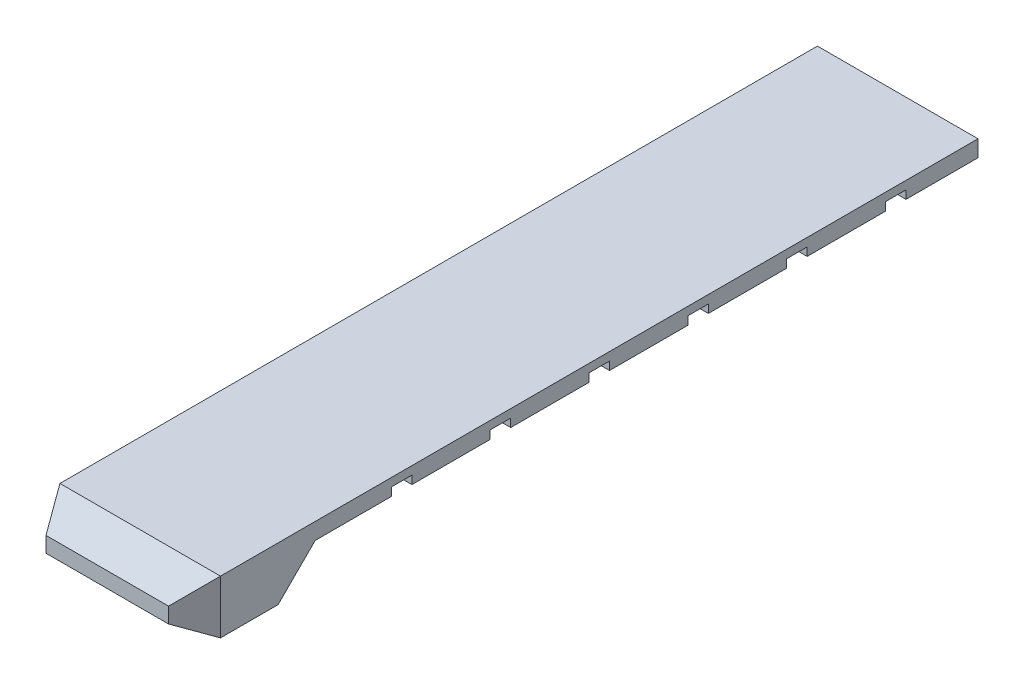
ISO-10303-21;
HEADER;
FILE_DESCRIPTION(('STEP AP214'),'2;1');
FILE_NAME('part.step','',(''),(''),'','','');
FILE_SCHEMA(('AUTOMOTIVE_DESIGN { 1 0 10303 214 1 1 1 1 }'));
ENDSEC;
DATA;
#1=APPLICATION_CONTEXT('core data for automotive mechanical design processes');
#2=APPLICATION_PROTOCOL_DEFINITION('international standard','automotive_design',2000,#1);
#3=PRODUCT_CONTEXT('',#1,'mechanical');
#4=PRODUCT('Part','Part','',(#3));
#5=PRODUCT_RELATED_PRODUCT_CATEGORY('part','',(#4));
#6=PRODUCT_DEFINITION_FORMATION('','',#4);
#7=PRODUCT_DEFINITION_CONTEXT('part definition',#1,'design');
#8=PRODUCT_DEFINITION('design','',#6,#7);
#9=PRODUCT_DEFINITION_SHAPE('','',#8);
#10=(LENGTH_UNIT() NAMED_UNIT(*) SI_UNIT(.MILLI.,.METRE.));
#11=(NAMED_UNIT(*) PLANE_ANGLE_UNIT() SI_UNIT($,.RADIAN.));
#12=(NAMED_UNIT(*) SI_UNIT($,.STERADIAN.) SOLID_ANGLE_UNIT());
#13=UNCERTAINTY_MEASURE_WITH_UNIT(LENGTH_MEASURE(1.E-05),#10,'distance_accuracy_value','');
#14=(GEOMETRIC_REPRESENTATION_CONTEXT(3) GLOBAL_UNCERTAINTY_ASSIGNED_CONTEXT((#13)) GLOBAL_UNIT_ASSIGNED_CONTEXT((#10,
#11,#12)) REPRESENTATION_CONTEXT('',''));
#15=CARTESIAN_POINT('',(0.,0.,0.));
#16=DIRECTION('',(0.,0.,1.));
#17=DIRECTION('',(1.,0.,0.));
#18=AXIS2_PLACEMENT_3D('',#15,#16,#17);
#19=CARTESIAN_POINT('',(212.999999374151,0.,-54.3));
#20=DIRECTION('',(1.,0.,0.));
#21=DIRECTION('',(0.,0.,1.));
#22=AXIS2_PLACEMENT_3D('',#19,#20,#21);
#23=PLANE('',#22);
#24=DIRECTION('',(0.,-1.,0.));
#25=VECTOR('',#24,1.);
#26=CARTESIAN_POINT('',(212.999999374151,0.75000000000003,-67.2000003576276));
#27=LINE('',#26,#25);
#28=CARTESIAN_POINT('',(212.999999374151,2.7,-67.2000003576276));
#29=VERTEX_POINT('',#28);
#30=CARTESIAN_POINT('',(212.999999374151,1.5,-67.2000003576276));
#31=VERTEX_POINT('',#30);
#32=EDGE_CURVE('E367',#29,#31,#27,.T.);
#33=ORIENTED_EDGE('',*,*,#32,.T.);
#34=DIRECTION('',(0.,0.,-1.));
#35=VECTOR('',#34,1.);
#36=CARTESIAN_POINT('',(212.999999374151,1.5,-12.9));
#37=LINE('',#36,#35);
#38=CARTESIAN_POINT('',(212.999999374151,1.5,-55.8000003576279));
#39=VERTEX_POINT('',#38);
#40=EDGE_CURVE('E331',#39,#31,#37,.T.);
#41=ORIENTED_EDGE('',*,*,#40,.F.);
#42=DIRECTION('',(0.,1.,0.));
#43=VECTOR('',#42,1.);
#44=CARTESIAN_POINT('',(212.999999374151,0.750000000000024,-55.8000003576279));
#45=LINE('',#44,#43);
#46=CARTESIAN_POINT('',(212.999999374151,2.7,-55.8000003576279));
#47=VERTEX_POINT('',#46);
#48=EDGE_CURVE('E470',#39,#47,#45,.T.);
#49=ORIENTED_EDGE('',*,*,#48,.T.);
#50=DIRECTION('',(0.,0.,1.));
#51=VECTOR('',#50,1.);
#52=CARTESIAN_POINT('',(212.999999374151,2.7,-54.3000001788139));
#53=LINE('',#52,#51);
#54=CARTESIAN_POINT('',(212.999999374151,2.7,-52.8000003576279));
#55=VERTEX_POINT('',#54);
#56=EDGE_CURVE('E538',#47,#55,#53,.T.);
#57=ORIENTED_EDGE('',*,*,#56,.T.);
#58=DIRECTION('',(0.,-1.,0.));
#59=VECTOR('',#58,1.);
#60=CARTESIAN_POINT('',(212.999999374151,0.750000000000024,-52.8000003576279));
#61=LINE('',#60,#59);
#62=CARTESIAN_POINT('',(212.999999374151,1.5,-52.8000003576279));
#63=VERTEX_POINT('',#62);
#64=EDGE_CURVE('E466',#55,#63,#61,.T.);
#65=ORIENTED_EDGE('',*,*,#64,.T.);
#66=DIRECTION('',(0.,0.,-1.));
#67=VECTOR('',#66,1.);
#68=CARTESIAN_POINT('',(212.999999374151,1.5,-12.9));
#69=LINE('',#68,#67);
#70=CARTESIAN_POINT('',(212.999999374151,1.5,-41.4000003576279));
#71=VERTEX_POINT('',#70);
#72=EDGE_CURVE('E478',#71,#63,#69,.T.);
#73=ORIENTED_EDGE('',*,*,#72,.F.);
#74=DIRECTION('',(0.,1.,0.));
#75=VECTOR('',#74,1.);
#76=CARTESIAN_POINT('',(212.999999374151,0.750000000000024,-41.4000003576279));
#77=LINE('',#76,#75);
#78=CARTESIAN_POINT('',(212.999999374151,2.7,-41.4000003576279));
#79=VERTEX_POINT('',#78);
#80=EDGE_CURVE('E557',#71,#79,#77,.T.);
#81=ORIENTED_EDGE('',*,*,#80,.T.);
#82=DIRECTION('',(0.,0.,1.));
#83=VECTOR('',#82,1.);
#84=CARTESIAN_POINT('',(212.999999374151,2.7,-47.1000001788139));
#85=LINE('',#84,#83);
#86=CARTESIAN_POINT('',(212.999999374151,2.7,-38.4000003576279));
#87=VERTEX_POINT('',#86);
#88=EDGE_CURVE('E571',#79,#87,#85,.T.);
#89=ORIENTED_EDGE('',*,*,#88,.T.);
#90=DIRECTION('',(0.,-1.,0.));
#91=VECTOR('',#90,1.);
#92=CARTESIAN_POINT('',(212.999999374151,0.750000000000024,-38.4000003576279));
#93=LINE('',#92,#91);
#94=CARTESIAN_POINT('',(212.999999374151,1.5,-38.4000003576279));
#95=VERTEX_POINT('',#94);
#96=EDGE_CURVE('E339',#87,#95,#93,.T.);
#97=ORIENTED_EDGE('',*,*,#96,.T.);
#98=DIRECTION('',(0.,0.,-1.));
#99=VECTOR('',#98,1.);
#100=CARTESIAN_POINT('',(212.999999374151,1.5,-12.9));
#101=LINE('',#100,#99);
#102=CARTESIAN_POINT('',(212.999999374151,1.5,-27.0000003576279));
#103=VERTEX_POINT('',#102);
#104=EDGE_CURVE('E408',#103,#95,#101,.T.);
#105=ORIENTED_EDGE('',*,*,#104,.F.);
#106=DIRECTION('',(0.,1.,0.));
#107=VECTOR('',#106,1.);
#108=CARTESIAN_POINT('',(212.999999374151,0.750000000000024,-27.0000003576279));
#109=LINE('',#108,#107);
#110=CARTESIAN_POINT('',(212.999999374151,2.7,-27.0000003576279));
#111=VERTEX_POINT('',#110);
#112=EDGE_CURVE('E450',#103,#111,#109,.T.);
#113=ORIENTED_EDGE('',*,*,#112,.T.);
#114=DIRECTION('',(0.,0.,1.));
#115=VECTOR('',#114,1.);
#116=CARTESIAN_POINT('',(212.999999374151,2.7,-39.9000001788139));
#117=LINE('',#116,#115);
#118=CARTESIAN_POINT('',(212.999999374151,2.7,-24.0000003576279));
#119=VERTEX_POINT('',#118);
#120=EDGE_CURVE('E332',#111,#119,#117,.T.);
#121=ORIENTED_EDGE('',*,*,#120,.T.);
#122=DIRECTION('',(0.,-1.,0.));
#123=VECTOR('',#122,1.);
#124=CARTESIAN_POINT('',(212.999999374151,0.750000000000024,-24.0000003576279));
#125=LINE('',#124,#123);
#126=CARTESIAN_POINT('',(212.999999374151,1.5,-24.0000003576279));
#127=VERTEX_POINT('',#126);
#128=EDGE_CURVE('E372',#119,#127,#125,.T.);
#129=ORIENTED_EDGE('',*,*,#128,.T.);
#130=DIRECTION('',(0.,0.,-1.));
#131=VECTOR('',#130,1.);
#132=CARTESIAN_POINT('',(212.999999374151,1.5,-12.9));
#133=LINE('',#132,#131);
#134=CARTESIAN_POINT('',(212.999999374151,1.5,-12.9));
#135=VERTEX_POINT('',#134);
#136=EDGE_CURVE('E407',#135,#127,#133,.T.);
#137=ORIENTED_EDGE('',*,*,#136,.F.);
#138=DIRECTION('',(0.,0.707106781186548,-0.707106781186547));
#139=VECTOR('',#138,1.);
#140=CARTESIAN_POINT('',(212.999999374151,-3.9,-7.5));
#141=LINE('',#140,#139);
#142=CARTESIAN_POINT('',(212.999999374151,-3.9,-7.5));
#143=VERTEX_POINT('',#142);
#144=EDGE_CURVE('E337',#143,#135,#141,.T.);
#145=ORIENTED_EDGE('',*,*,#144,.F.);
#146=DIRECTION('',(0.,0.,-1.));
#147=VECTOR('',#146,1.);
#148=CARTESIAN_POINT('',(212.999999374151,-3.9,0.900000000000012));
#149=LINE('',#148,#147);
#150=CARTESIAN_POINT('',(212.999999374151,-3.9,0.900000000000012));
#151=VERTEX_POINT('',#150);
#152=EDGE_CURVE('E24',#151,#143,#149,.T.);
#153=ORIENTED_EDGE('',*,*,#152,.F.);
#154=DIRECTION('',(0.,-1.,0.));
#155=VECTOR('',#154,1.);
#156=CARTESIAN_POINT('',(212.999999374151,3.9,0.900000000000012));
#157=LINE('',#156,#155);
#158=CARTESIAN_POINT('',(212.999999374151,3.9,0.900000000000012));
#159=VERTEX_POINT('',#158);
#160=EDGE_CURVE('E299',#159,#151,#157,.T.);
#161=ORIENTED_EDGE('',*,*,#160,.F.);
#162=DIRECTION('',(0.,0.,1.));
#163=VECTOR('',#162,1.);
#164=CARTESIAN_POINT('',(212.999999374151,3.9,-109.5));
#165=LINE('',#164,#163);
#166=CARTESIAN_POINT('',(212.999999374151,3.9,-109.5));
#167=VERTEX_POINT('',#166);
#168=EDGE_CURVE('E9',#167,#159,#165,.T.);
#169=ORIENTED_EDGE('',*,*,#168,.F.);
#170=DIRECTION('',(0.,1.,0.));
#171=VECTOR('',#170,1.);
#172=CARTESIAN_POINT('',(212.999999374151,1.50000000000003,-109.5));
#173=LINE('',#172,#171);
#174=CARTESIAN_POINT('',(212.999999374151,1.50000000000003,-109.5));
#175=VERTEX_POINT('',#174);
#176=EDGE_CURVE('E624',#175,#167,#173,.T.);
#177=ORIENTED_EDGE('',*,*,#176,.F.);
#178=DIRECTION('',(0.,0.,-1.));
#179=VECTOR('',#178,1.);
#180=CARTESIAN_POINT('',(212.999999374151,1.5,-12.9));
#181=LINE('',#180,#179);
#182=CARTESIAN_POINT('',(212.999999374151,1.50000000000002,-99.0000003576276));
#183=VERTEX_POINT('',#182);
#184=EDGE_CURVE('E429',#183,#175,#181,.T.);
#185=ORIENTED_EDGE('',*,*,#184,.F.);
#186=DIRECTION('',(0.,1.,0.));
#187=VECTOR('',#186,1.);
#188=CARTESIAN_POINT('',(212.999999374151,0.75000000000003,-99.0000003576276));
#189=LINE('',#188,#187);
#190=CARTESIAN_POINT('',(212.999999374151,2.7,-99.0000003576276));
#191=VERTEX_POINT('',#190);
#192=EDGE_CURVE('E586',#183,#191,#189,.T.);
#193=ORIENTED_EDGE('',*,*,#192,.T.);
#194=DIRECTION('',(0.,0.,1.));
#195=VECTOR('',#194,1.);
#196=CARTESIAN_POINT('',(212.999999374151,2.7,-75.9000001788138));
#197=LINE('',#196,#195);
#198=CARTESIAN_POINT('',(212.999999374151,2.7,-96.0000003576276));
#199=VERTEX_POINT('',#198);
#200=EDGE_CURVE('E461',#191,#199,#197,.T.);
#201=ORIENTED_EDGE('',*,*,#200,.T.);
#202=DIRECTION('',(0.,-1.,0.));
#203=VECTOR('',#202,1.);
#204=CARTESIAN_POINT('',(212.999999374151,0.75000000000003,-96.0000003576276));
#205=LINE('',#204,#203);
#206=CARTESIAN_POINT('',(212.999999374151,1.50000000000002,-96.0000003576276));
#207=VERTEX_POINT('',#206);
#208=EDGE_CURVE('E431',#199,#207,#205,.T.);
#209=ORIENTED_EDGE('',*,*,#208,.T.);
#210=DIRECTION('',(0.,0.,-1.));
#211=VECTOR('',#210,1.);
#212=CARTESIAN_POINT('',(212.999999374151,1.5,-12.9));
#213=LINE('',#212,#211);
#214=CARTESIAN_POINT('',(212.999999374151,1.50000000000002,-84.6000003576276));
#215=VERTEX_POINT('',#214);
#216=EDGE_CURVE('E528',#215,#207,#213,.T.);
#217=ORIENTED_EDGE('',*,*,#216,.F.);
#218=DIRECTION('',(0.,1.,0.));
#219=VECTOR('',#218,1.);
#220=CARTESIAN_POINT('',(212.999999374151,0.75000000000003,-84.6000003576276));
#221=LINE('',#220,#219);
#222=CARTESIAN_POINT('',(212.999999374151,2.7,-84.6000003576276));
#223=VERTEX_POINT('',#222);
#224=EDGE_CURVE('E482',#215,#223,#221,.T.);
#225=ORIENTED_EDGE('',*,*,#224,.T.);
#226=DIRECTION('',(0.,0.,1.));
#227=VECTOR('',#226,1.);
#228=CARTESIAN_POINT('',(212.999999374151,2.7,-68.7000001788138));
#229=LINE('',#228,#227);
#230=CARTESIAN_POINT('',(212.999999374151,2.7,-81.6000003576276));
#231=VERTEX_POINT('',#230);
#232=EDGE_CURVE('E501',#223,#231,#229,.T.);
#233=ORIENTED_EDGE('',*,*,#232,.T.);
#234=DIRECTION('',(0.,-1.,0.));
#235=VECTOR('',#234,1.);
#236=CARTESIAN_POINT('',(212.999999374151,0.75000000000003,-81.6000003576276));
#237=LINE('',#236,#235);
#238=CARTESIAN_POINT('',(212.999999374151,1.5,-81.6000003576276));
#239=VERTEX_POINT('',#238);
#240=EDGE_CURVE('E495',#231,#239,#237,.T.);
#241=ORIENTED_EDGE('',*,*,#240,.T.);
#242=DIRECTION('',(0.,0.,-1.));
#243=VECTOR('',#242,1.);
#244=CARTESIAN_POINT('',(212.999999374151,1.5,-12.9));
#245=LINE('',#244,#243);
#246=CARTESIAN_POINT('',(212.999999374151,1.5,-70.2000003576276));
#247=VERTEX_POINT('',#246);
#248=EDGE_CURVE('E621',#247,#239,#245,.T.);
#249=ORIENTED_EDGE('',*,*,#248,.F.);
#250=DIRECTION('',(0.,1.,0.));
#251=VECTOR('',#250,1.);
#252=CARTESIAN_POINT('',(212.999999374151,0.75000000000003,-70.2000003576276));
#253=LINE('',#252,#251);
#254=CARTESIAN_POINT('',(212.999999374151,2.7,-70.2000003576276));
#255=VERTEX_POINT('',#254);
#256=EDGE_CURVE('E394',#247,#255,#253,.T.);
#257=ORIENTED_EDGE('',*,*,#256,.T.);
#258=DIRECTION('',(0.,0.,1.));
#259=VECTOR('',#258,1.);
#260=CARTESIAN_POINT('',(212.999999374151,2.7,-61.5000001788138));
#261=LINE('',#260,#259);
#262=EDGE_CURVE('E377',#255,#29,#261,.T.);
#263=ORIENTED_EDGE('',*,*,#262,.T.);
#264=EDGE_LOOP('',(#33,#41,#49,#57,#65,#73,#81,#89,#97,#105,#113,#121,#129,#137,#145,#153,#161,
#169,#177,#185,#193,#201,#209,#217,#225,#233,#241,#249,#257,#263));
#265=FACE_BOUND('',#264,.T.);
#266=ADVANCED_FACE('F15',(#265),#23,.F.);
#267=CARTESIAN_POINT('',(212.999999374151,3.9,-109.5));
#268=DIRECTION('',(0.,1.,0.));
#269=DIRECTION('',(0.,0.,-1.));
#270=AXIS2_PLACEMENT_3D('',#267,#268,#269);
#271=PLANE('',#270);
#272=ORIENTED_EDGE('',*,*,#168,.T.);
#273=DIRECTION('',(1.,0.,0.));
#274=VECTOR('',#273,1.);
#275=CARTESIAN_POINT('',(212.999999374151,3.9,0.900000000000012));
#276=LINE('',#275,#274);
#277=CARTESIAN_POINT('',(236.399999374151,3.9,0.9));
#278=VERTEX_POINT('',#277);
#279=EDGE_CURVE('E294',#159,#278,#276,.T.);
#280=ORIENTED_EDGE('',*,*,#279,.T.);
#281=DIRECTION('',(0.,0.,1.));
#282=VECTOR('',#281,1.);
#283=CARTESIAN_POINT('',(236.399999374151,3.9,-109.5));
#284=LINE('',#283,#282);
#285=CARTESIAN_POINT('',(236.399999374151,3.9,-109.5));
#286=VERTEX_POINT('',#285);
#287=EDGE_CURVE('E603',#286,#278,#284,.T.);
#288=ORIENTED_EDGE('',*,*,#287,.F.);
#289=DIRECTION('',(1.,0.,0.));
#290=VECTOR('',#289,1.);
#291=CARTESIAN_POINT('',(212.999999374151,3.9,-109.5));
#292=LINE('',#291,#290);
#293=EDGE_CURVE('E300',#167,#286,#292,.T.);
#294=ORIENTED_EDGE('',*,*,#293,.F.);
#295=EDGE_LOOP('',(#272,#280,#288,#294));
#296=FACE_BOUND('',#295,.T.);
#297=ADVANCED_FACE('F291',(#296),#271,.T.);
#298=CARTESIAN_POINT('',(212.999999374151,-3.9,0.900000000000012));
#299=DIRECTION('',(0.,-1.,0.));
#300=DIRECTION('',(0.,0.,-1.));
#301=AXIS2_PLACEMENT_3D('',#298,#299,#300);
#302=PLANE('',#301);
#303=ORIENTED_EDGE('',*,*,#152,.T.);
#304=DIRECTION('',(1.,0.,0.));
#305=VECTOR('',#304,1.);
#306=CARTESIAN_POINT('',(212.999999374151,-3.9,-7.5));
#307=LINE('',#306,#305);
#308=CARTESIAN_POINT('',(236.399999374151,-3.9,-7.5));
#309=VERTEX_POINT('',#308);
#310=EDGE_CURVE('E18',#143,#309,#307,.T.);
#311=ORIENTED_EDGE('',*,*,#310,.T.);
#312=DIRECTION('',(0.,0.,-1.));
#313=VECTOR('',#312,1.);
#314=CARTESIAN_POINT('',(236.399999374151,-3.9,0.900000000000012));
#315=LINE('',#314,#313);
#316=CARTESIAN_POINT('',(236.399999374151,-3.9,0.9));
#317=VERTEX_POINT('',#316);
#318=EDGE_CURVE('E610',#317,#309,#315,.T.);
#319=ORIENTED_EDGE('',*,*,#318,.F.);
#320=DIRECTION('',(1.,0.,0.));
#321=VECTOR('',#320,1.);
#322=CARTESIAN_POINT('',(212.999999374151,-3.9,0.900000000000012));
#323=LINE('',#322,#321);
#324=EDGE_CURVE('E373',#151,#317,#323,.T.);
#325=ORIENTED_EDGE('',*,*,#324,.F.);
#326=EDGE_LOOP('',(#303,#311,#319,#325));
#327=FACE_BOUND('',#326,.T.);
#328=ADVANCED_FACE('F979',(#327),#302,.T.);
#329=CARTESIAN_POINT('',(212.999999374151,-3.9,-7.5));
#330=DIRECTION('',(0.,-0.707106781186547,-0.707106781186548));
#331=DIRECTION('',(0.,-0.707106781186548,0.707106781186547));
#332=AXIS2_PLACEMENT_3D('',#329,#330,#331);
#333=PLANE('',#332);
#334=ORIENTED_EDGE('',*,*,#144,.T.);
#335=DIRECTION('',(1.,0.,0.));
#336=VECTOR('',#335,1.);
#337=CARTESIAN_POINT('',(212.999999374151,1.5,-12.9));
#338=LINE('',#337,#336);
#339=CARTESIAN_POINT('',(236.399999374151,1.5,-12.9));
#340=VERTEX_POINT('',#339);
#341=EDGE_CURVE('E404',#135,#340,#338,.T.);
#342=ORIENTED_EDGE('',*,*,#341,.T.);
#343=DIRECTION('',(0.,0.707106781186548,-0.707106781186547));
#344=VECTOR('',#343,1.);
#345=CARTESIAN_POINT('',(236.399999374151,-3.9,-7.5));
#346=LINE('',#345,#344);
#347=EDGE_CURVE('E611',#309,#340,#346,.T.);
#348=ORIENTED_EDGE('',*,*,#347,.F.);
#349=ORIENTED_EDGE('',*,*,#310,.F.);
#350=EDGE_LOOP('',(#334,#342,#348,#349));
#351=FACE_BOUND('',#350,.T.);
#352=ADVANCED_FACE('F1001',(#351),#333,.T.);
#353=CARTESIAN_POINT('',(212.999999374151,1.5,-12.9));
#354=DIRECTION('',(0.,-1.,0.));
#355=DIRECTION('',(0.,0.,-1.));
#356=AXIS2_PLACEMENT_3D('',#353,#354,#355);
#357=PLANE('',#356);
#358=DIRECTION('',(1.,0.,0.));
#359=VECTOR('',#358,1.);
#360=CARTESIAN_POINT('',(212.999999374151,1.50000000000002,-67.2000003576276));
#361=LINE('',#360,#359);
#362=CARTESIAN_POINT('',(236.399999374151,1.5,-67.2000003576276));
#363=VERTEX_POINT('',#362);
#364=EDGE_CURVE('E400',#31,#363,#361,.T.);
#365=ORIENTED_EDGE('',*,*,#364,.T.);
#366=DIRECTION('',(0.,0.,-1.));
#367=VECTOR('',#366,1.);
#368=CARTESIAN_POINT('',(236.399999374151,1.5,-12.9));
#369=LINE('',#368,#367);
#370=CARTESIAN_POINT('',(236.399999374151,1.5,-55.8000003576279));
#371=VERTEX_POINT('',#370);
#372=EDGE_CURVE('E386',#371,#363,#369,.T.);
#373=ORIENTED_EDGE('',*,*,#372,.F.);
#374=DIRECTION('',(-1.,0.,0.));
#375=VECTOR('',#374,1.);
#376=CARTESIAN_POINT('',(224.699999374152,1.5,-55.8000003576279));
#377=LINE('',#376,#375);
#378=EDGE_CURVE('E510',#371,#39,#377,.T.);
#379=ORIENTED_EDGE('',*,*,#378,.T.);
#380=ORIENTED_EDGE('',*,*,#40,.T.);
#381=EDGE_LOOP('',(#365,#373,#379,#380));
#382=FACE_BOUND('',#381,.T.);
#383=ADVANCED_FACE('F694',(#382),#357,.T.);
#384=CARTESIAN_POINT('',(212.999999374151,1.50000000000003,-109.5));
#385=DIRECTION('',(0.,0.,-1.));
#386=DIRECTION('',(-1.,0.,0.));
#387=AXIS2_PLACEMENT_3D('',#384,#385,#386);
#388=PLANE('',#387);
#389=ORIENTED_EDGE('',*,*,#176,.T.);
#390=ORIENTED_EDGE('',*,*,#293,.T.);
#391=DIRECTION('',(0.,1.,0.));
#392=VECTOR('',#391,1.);
#393=CARTESIAN_POINT('',(236.399999374151,1.50000000000003,-109.5));
#394=LINE('',#393,#392);
#395=CARTESIAN_POINT('',(236.399999374151,1.50000000000003,-109.5));
#396=VERTEX_POINT('',#395);
#397=EDGE_CURVE('E599',#396,#286,#394,.T.);
#398=ORIENTED_EDGE('',*,*,#397,.F.);
#399=DIRECTION('',(1.,0.,0.));
#400=VECTOR('',#399,1.);
#401=CARTESIAN_POINT('',(212.999999374151,1.50000000000003,-109.5));
#402=LINE('',#401,#400);
#403=EDGE_CURVE('E471',#175,#396,#402,.T.);
#404=ORIENTED_EDGE('',*,*,#403,.F.);
#405=EDGE_LOOP('',(#389,#390,#398,#404));
#406=FACE_BOUND('',#405,.T.);
#407=ADVANCED_FACE('F635',(#406),#388,.T.);
#408=CARTESIAN_POINT('',(212.999999374151,1.5,-12.9));
#409=DIRECTION('',(0.,-1.,0.));
#410=DIRECTION('',(0.,0.,-1.));
#411=AXIS2_PLACEMENT_3D('',#408,#409,#410);
#412=PLANE('',#411);
#413=DIRECTION('',(-1.,0.,0.));
#414=VECTOR('',#413,1.);
#415=CARTESIAN_POINT('',(224.699999374152,1.50000000000002,-70.2000003576276));
#416=LINE('',#415,#414);
#417=CARTESIAN_POINT('',(236.399999374151,1.5,-70.2000003576276));
#418=VERTEX_POINT('',#417);
#419=EDGE_CURVE('E307',#418,#247,#416,.T.);
#420=ORIENTED_EDGE('',*,*,#419,.T.);
#421=ORIENTED_EDGE('',*,*,#248,.T.);
#422=DIRECTION('',(1.,0.,0.));
#423=VECTOR('',#422,1.);
#424=CARTESIAN_POINT('',(212.999999374151,1.50000000000002,-81.6000003576276));
#425=LINE('',#424,#423);
#426=CARTESIAN_POINT('',(236.399999374151,1.5,-81.6000003576276));
#427=VERTEX_POINT('',#426);
#428=EDGE_CURVE('E488',#239,#427,#425,.T.);
#429=ORIENTED_EDGE('',*,*,#428,.T.);
#430=DIRECTION('',(0.,0.,-1.));
#431=VECTOR('',#430,1.);
#432=CARTESIAN_POINT('',(236.399999374151,1.5,-12.9));
#433=LINE('',#432,#431);
#434=EDGE_CURVE('E459',#418,#427,#433,.T.);
#435=ORIENTED_EDGE('',*,*,#434,.F.);
#436=EDGE_LOOP('',(#420,#421,#429,#435));
#437=FACE_BOUND('',#436,.T.);
#438=ADVANCED_FACE('F674',(#437),#412,.T.);
#439=CARTESIAN_POINT('',(212.999999374151,1.5,-12.9));
#440=DIRECTION('',(0.,-1.,0.));
#441=DIRECTION('',(0.,0.,-1.));
#442=AXIS2_PLACEMENT_3D('',#439,#440,#441);
#443=PLANE('',#442);
#444=DIRECTION('',(1.,0.,0.));
#445=VECTOR('',#444,1.);
#446=CARTESIAN_POINT('',(212.999999374151,1.5,-24.0000003576279));
#447=LINE('',#446,#445);
#448=CARTESIAN_POINT('',(236.399999374151,1.5,-24.0000003576279));
#449=VERTEX_POINT('',#448);
#450=EDGE_CURVE('E378',#127,#449,#447,.T.);
#451=ORIENTED_EDGE('',*,*,#450,.T.);
#452=DIRECTION('',(0.,0.,-1.));
#453=VECTOR('',#452,1.);
#454=CARTESIAN_POINT('',(236.399999374151,1.5,-12.9));
#455=LINE('',#454,#453);
#456=EDGE_CURVE('E612',#340,#449,#455,.T.);
#457=ORIENTED_EDGE('',*,*,#456,.F.);
#458=ORIENTED_EDGE('',*,*,#341,.F.);
#459=ORIENTED_EDGE('',*,*,#136,.T.);
#460=EDGE_LOOP('',(#451,#457,#458,#459));
#461=FACE_BOUND('',#460,.T.);
#462=ADVANCED_FACE('F1012',(#461),#443,.T.);
#463=CARTESIAN_POINT('',(212.999999374151,1.5,-12.9));
#464=DIRECTION('',(0.,-1.,0.));
#465=DIRECTION('',(0.,0.,-1.));
#466=AXIS2_PLACEMENT_3D('',#463,#464,#465);
#467=PLANE('',#466);
#468=DIRECTION('',(-1.,0.,0.));
#469=VECTOR('',#468,1.);
#470=CARTESIAN_POINT('',(224.699999374152,1.5,-27.0000003576279));
#471=LINE('',#470,#469);
#472=CARTESIAN_POINT('',(236.399999374151,1.5,-27.0000003576279));
#473=VERTEX_POINT('',#472);
#474=EDGE_CURVE('E360',#473,#103,#471,.T.);
#475=ORIENTED_EDGE('',*,*,#474,.T.);
#476=ORIENTED_EDGE('',*,*,#104,.T.);
#477=DIRECTION('',(1.,0.,0.));
#478=VECTOR('',#477,1.);
#479=CARTESIAN_POINT('',(212.999999374151,1.5,-38.4000003576279));
#480=LINE('',#479,#478);
#481=CARTESIAN_POINT('',(236.399999374151,1.5,-38.4000003576279));
#482=VERTEX_POINT('',#481);
#483=EDGE_CURVE('E343',#95,#482,#480,.T.);
#484=ORIENTED_EDGE('',*,*,#483,.T.);
#485=DIRECTION('',(0.,0.,-1.));
#486=VECTOR('',#485,1.);
#487=CARTESIAN_POINT('',(236.399999374151,1.5,-12.9));
#488=LINE('',#487,#486);
#489=EDGE_CURVE('E388',#473,#482,#488,.T.);
#490=ORIENTED_EDGE('',*,*,#489,.F.);
#491=EDGE_LOOP('',(#475,#476,#484,#490));
#492=FACE_BOUND('',#491,.T.);
#493=ADVANCED_FACE('F745',(#492),#467,.T.);
#494=CARTESIAN_POINT('',(212.999999374151,1.5,-12.9));
#495=DIRECTION('',(0.,-1.,0.));
#496=DIRECTION('',(0.,0.,-1.));
#497=AXIS2_PLACEMENT_3D('',#494,#495,#496);
#498=PLANE('',#497);
#499=DIRECTION('',(-1.,0.,0.));
#500=VECTOR('',#499,1.);
#501=CARTESIAN_POINT('',(224.699999374152,1.50000000000002,-84.6000003576276));
#502=LINE('',#501,#500);
#503=CARTESIAN_POINT('',(236.399999374151,1.50000000000002,-84.6000003576276));
#504=VERTEX_POINT('',#503);
#505=EDGE_CURVE('E468',#504,#215,#502,.T.);
#506=ORIENTED_EDGE('',*,*,#505,.T.);
#507=ORIENTED_EDGE('',*,*,#216,.T.);
#508=DIRECTION('',(1.,0.,0.));
#509=VECTOR('',#508,1.);
#510=CARTESIAN_POINT('',(212.999999374151,1.50000000000003,-96.0000003576276));
#511=LINE('',#510,#509);
#512=CARTESIAN_POINT('',(236.399999374151,1.50000000000002,-96.0000003576276));
#513=VERTEX_POINT('',#512);
#514=EDGE_CURVE('E436',#207,#513,#511,.T.);
#515=ORIENTED_EDGE('',*,*,#514,.T.);
#516=DIRECTION('',(0.,0.,-1.));
#517=VECTOR('',#516,1.);
#518=CARTESIAN_POINT('',(236.399999374151,1.5,-12.9));
#519=LINE('',#518,#517);
#520=EDGE_CURVE('E554',#504,#513,#519,.T.);
#521=ORIENTED_EDGE('',*,*,#520,.F.);
#522=EDGE_LOOP('',(#506,#507,#515,#521));
#523=FACE_BOUND('',#522,.T.);
#524=ADVANCED_FACE('F656',(#523),#498,.T.);
#525=CARTESIAN_POINT('',(212.999999374151,1.5,-12.9));
#526=DIRECTION('',(0.,-1.,0.));
#527=DIRECTION('',(0.,0.,-1.));
#528=AXIS2_PLACEMENT_3D('',#525,#526,#527);
#529=PLANE('',#528);
#530=DIRECTION('',(1.,0.,0.));
#531=VECTOR('',#530,1.);
#532=CARTESIAN_POINT('',(212.999999374151,1.5,-52.8000003576279));
#533=LINE('',#532,#531);
#534=CARTESIAN_POINT('',(236.399999374151,1.5,-52.8000003576279));
#535=VERTEX_POINT('',#534);
#536=EDGE_CURVE('E465',#63,#535,#533,.T.);
#537=ORIENTED_EDGE('',*,*,#536,.T.);
#538=DIRECTION('',(0.,0.,-1.));
#539=VECTOR('',#538,1.);
#540=CARTESIAN_POINT('',(236.399999374151,1.5,-12.9));
#541=LINE('',#540,#539);
#542=CARTESIAN_POINT('',(236.399999374151,1.5,-41.4000003576279));
#543=VERTEX_POINT('',#542);
#544=EDGE_CURVE('E387',#543,#535,#541,.T.);
#545=ORIENTED_EDGE('',*,*,#544,.F.);
#546=DIRECTION('',(-1.,0.,0.));
#547=VECTOR('',#546,1.);
#548=CARTESIAN_POINT('',(224.699999374152,1.5,-41.4000003576279));
#549=LINE('',#548,#547);
#550=EDGE_CURVE('E442',#543,#71,#549,.T.);
#551=ORIENTED_EDGE('',*,*,#550,.T.);
#552=ORIENTED_EDGE('',*,*,#72,.T.);
#553=EDGE_LOOP('',(#537,#545,#551,#552));
#554=FACE_BOUND('',#553,.T.);
#555=ADVANCED_FACE('F730',(#554),#529,.T.);
#556=CARTESIAN_POINT('',(212.999999374151,1.5,-12.9));
#557=DIRECTION('',(0.,-1.,0.));
#558=DIRECTION('',(0.,0.,-1.));
#559=AXIS2_PLACEMENT_3D('',#556,#557,#558);
#560=PLANE('',#559);
#561=DIRECTION('',(-1.,0.,0.));
#562=VECTOR('',#561,1.);
#563=CARTESIAN_POINT('',(224.699999374152,1.50000000000003,-99.0000003576276));
#564=LINE('',#563,#562);
#565=CARTESIAN_POINT('',(236.399999374151,1.50000000000002,-99.0000003576276));
#566=VERTEX_POINT('',#565);
#567=EDGE_CURVE('E542',#566,#183,#564,.T.);
#568=ORIENTED_EDGE('',*,*,#567,.T.);
#569=ORIENTED_EDGE('',*,*,#184,.T.);
#570=ORIENTED_EDGE('',*,*,#403,.T.);
#571=DIRECTION('',(0.,0.,-1.));
#572=VECTOR('',#571,1.);
#573=CARTESIAN_POINT('',(236.399999374151,1.5,-12.9));
#574=LINE('',#573,#572);
#575=EDGE_CURVE('E583',#566,#396,#574,.T.);
#576=ORIENTED_EDGE('',*,*,#575,.F.);
#577=EDGE_LOOP('',(#568,#569,#570,#576));
#578=FACE_BOUND('',#577,.T.);
#579=ADVANCED_FACE('F639',(#578),#560,.T.);
#580=CARTESIAN_POINT('',(236.399999374151,0.,-54.3));
#581=DIRECTION('',(1.,0.,0.));
#582=DIRECTION('',(0.,1.,0.));
#583=AXIS2_PLACEMENT_3D('',#580,#581,#582);
#584=PLANE('',#583);
#585=DIRECTION('',(0.,1.,0.));
#586=VECTOR('',#585,1.);
#587=CARTESIAN_POINT('',(236.399999374151,0.75000000000003,-67.2000003576276));
#588=LINE('',#587,#586);
#589=CARTESIAN_POINT('',(236.399999374151,2.7,-67.2000003576276));
#590=VERTEX_POINT('',#589);
#591=EDGE_CURVE('E369',#363,#590,#588,.T.);
#592=ORIENTED_EDGE('',*,*,#591,.T.);
#593=DIRECTION('',(0.,0.,-1.));
#594=VECTOR('',#593,1.);
#595=CARTESIAN_POINT('',(236.399999374151,2.7,-61.5000001788138));
#596=LINE('',#595,#594);
#597=CARTESIAN_POINT('',(236.399999374151,2.7,-70.2000003576276));
#598=VERTEX_POINT('',#597);
#599=EDGE_CURVE('E385',#590,#598,#596,.T.);
#600=ORIENTED_EDGE('',*,*,#599,.T.);
#601=DIRECTION('',(0.,-1.,0.));
#602=VECTOR('',#601,1.);
#603=CARTESIAN_POINT('',(236.399999374151,0.75000000000003,-70.2000003576276));
#604=LINE('',#603,#602);
#605=EDGE_CURVE('E401',#598,#418,#604,.T.);
#606=ORIENTED_EDGE('',*,*,#605,.T.);
#607=ORIENTED_EDGE('',*,*,#434,.T.);
#608=DIRECTION('',(0.,1.,0.));
#609=VECTOR('',#608,1.);
#610=CARTESIAN_POINT('',(236.399999374151,0.75000000000003,-81.6000003576276));
#611=LINE('',#610,#609);
#612=CARTESIAN_POINT('',(236.399999374151,2.7,-81.6000003576276));
#613=VERTEX_POINT('',#612);
#614=EDGE_CURVE('E500',#427,#613,#611,.T.);
#615=ORIENTED_EDGE('',*,*,#614,.T.);
#616=DIRECTION('',(0.,0.,-1.));
#617=VECTOR('',#616,1.);
#618=CARTESIAN_POINT('',(236.399999374151,2.7,-68.7000001788138));
#619=LINE('',#618,#617);
#620=CARTESIAN_POINT('',(236.399999374151,2.7,-84.6000003576276));
#621=VERTEX_POINT('',#620);
#622=EDGE_CURVE('E503',#613,#621,#619,.T.);
#623=ORIENTED_EDGE('',*,*,#622,.T.);
#624=DIRECTION('',(0.,-1.,0.));
#625=VECTOR('',#624,1.);
#626=CARTESIAN_POINT('',(236.399999374151,0.75000000000003,-84.6000003576276));
#627=LINE('',#626,#625);
#628=EDGE_CURVE('E472',#621,#504,#627,.T.);
#629=ORIENTED_EDGE('',*,*,#628,.T.);
#630=ORIENTED_EDGE('',*,*,#520,.T.);
#631=DIRECTION('',(0.,1.,0.));
#632=VECTOR('',#631,1.);
#633=CARTESIAN_POINT('',(236.399999374151,0.75000000000003,-96.0000003576276));
#634=LINE('',#633,#632);
#635=CARTESIAN_POINT('',(236.399999374151,2.7,-96.0000003576276));
#636=VERTEX_POINT('',#635);
#637=EDGE_CURVE('E516',#513,#636,#634,.T.);
#638=ORIENTED_EDGE('',*,*,#637,.T.);
#639=DIRECTION('',(0.,0.,-1.));
#640=VECTOR('',#639,1.);
#641=CARTESIAN_POINT('',(236.399999374151,2.7,-75.9000001788138));
#642=LINE('',#641,#640);
#643=CARTESIAN_POINT('',(236.399999374151,2.7,-99.0000003576276));
#644=VERTEX_POINT('',#643);
#645=EDGE_CURVE('E456',#636,#644,#642,.T.);
#646=ORIENTED_EDGE('',*,*,#645,.T.);
#647=DIRECTION('',(0.,-1.,0.));
#648=VECTOR('',#647,1.);
#649=CARTESIAN_POINT('',(236.399999374151,0.75000000000003,-99.0000003576276));
#650=LINE('',#649,#648);
#651=EDGE_CURVE('E537',#644,#566,#650,.T.);
#652=ORIENTED_EDGE('',*,*,#651,.T.);
#653=ORIENTED_EDGE('',*,*,#575,.T.);
#654=ORIENTED_EDGE('',*,*,#397,.T.);
#655=ORIENTED_EDGE('',*,*,#287,.T.);
#656=DIRECTION('',(0.,-1.,0.));
#657=VECTOR('',#656,1.);
#658=CARTESIAN_POINT('',(236.399999374151,3.9,0.900000000000012));
#659=LINE('',#658,#657);
#660=EDGE_CURVE('E348',#278,#317,#659,.T.);
#661=ORIENTED_EDGE('',*,*,#660,.T.);
#662=ORIENTED_EDGE('',*,*,#318,.T.);
#663=ORIENTED_EDGE('',*,*,#347,.T.);
#664=ORIENTED_EDGE('',*,*,#456,.T.);
#665=DIRECTION('',(0.,1.,0.));
#666=VECTOR('',#665,1.);
#667=CARTESIAN_POINT('',(236.399999374151,0.750000000000024,-24.0000003576279));
#668=LINE('',#667,#666);
#669=CARTESIAN_POINT('',(236.399999374151,2.7,-24.0000003576279));
#670=VERTEX_POINT('',#669);
#671=EDGE_CURVE('E352',#449,#670,#668,.T.);
#672=ORIENTED_EDGE('',*,*,#671,.T.);
#673=DIRECTION('',(0.,0.,-1.));
#674=VECTOR('',#673,1.);
#675=CARTESIAN_POINT('',(236.399999374151,2.7,-39.9000001788139));
#676=LINE('',#675,#674);
#677=CARTESIAN_POINT('',(236.399999374151,2.7,-27.0000003576279));
#678=VERTEX_POINT('',#677);
#679=EDGE_CURVE('E452',#670,#678,#676,.T.);
#680=ORIENTED_EDGE('',*,*,#679,.T.);
#681=DIRECTION('',(0.,-1.,0.));
#682=VECTOR('',#681,1.);
#683=CARTESIAN_POINT('',(236.399999374151,0.750000000000024,-27.0000003576279));
#684=LINE('',#683,#682);
#685=EDGE_CURVE('E430',#678,#473,#684,.T.);
#686=ORIENTED_EDGE('',*,*,#685,.T.);
#687=ORIENTED_EDGE('',*,*,#489,.T.);
#688=DIRECTION('',(0.,1.,0.));
#689=VECTOR('',#688,1.);
#690=CARTESIAN_POINT('',(236.399999374151,0.750000000000024,-38.4000003576279));
#691=LINE('',#690,#689);
#692=CARTESIAN_POINT('',(236.399999374151,2.7,-38.4000003576279));
#693=VERTEX_POINT('',#692);
#694=EDGE_CURVE('E566',#482,#693,#691,.T.);
#695=ORIENTED_EDGE('',*,*,#694,.T.);
#696=DIRECTION('',(0.,0.,-1.));
#697=VECTOR('',#696,1.);
#698=CARTESIAN_POINT('',(236.399999374151,2.7,-47.1000001788139));
#699=LINE('',#698,#697);
#700=CARTESIAN_POINT('',(236.399999374151,2.7,-41.4000003576279));
#701=VERTEX_POINT('',#700);
#702=EDGE_CURVE('E576',#693,#701,#699,.T.);
#703=ORIENTED_EDGE('',*,*,#702,.T.);
#704=DIRECTION('',(0.,-1.,0.));
#705=VECTOR('',#704,1.);
#706=CARTESIAN_POINT('',(236.399999374151,0.750000000000024,-41.4000003576279));
#707=LINE('',#706,#705);
#708=EDGE_CURVE('E443',#701,#543,#707,.T.);
#709=ORIENTED_EDGE('',*,*,#708,.T.);
#710=ORIENTED_EDGE('',*,*,#544,.T.);
#711=DIRECTION('',(0.,1.,0.));
#712=VECTOR('',#711,1.);
#713=CARTESIAN_POINT('',(236.399999374151,0.750000000000024,-52.8000003576279));
#714=LINE('',#713,#712);
#715=CARTESIAN_POINT('',(236.399999374151,2.7,-52.8000003576279));
#716=VERTEX_POINT('',#715);
#717=EDGE_CURVE('E534',#535,#716,#714,.T.);
#718=ORIENTED_EDGE('',*,*,#717,.T.);
#719=DIRECTION('',(0.,0.,-1.));
#720=VECTOR('',#719,1.);
#721=CARTESIAN_POINT('',(236.399999374151,2.7,-54.3000001788139));
#722=LINE('',#721,#720);
#723=CARTESIAN_POINT('',(236.399999374151,2.7,-55.8000003576279));
#724=VERTEX_POINT('',#723);
#725=EDGE_CURVE('E446',#716,#724,#722,.T.);
#726=ORIENTED_EDGE('',*,*,#725,.T.);
#727=DIRECTION('',(0.,-1.,0.));
#728=VECTOR('',#727,1.);
#729=CARTESIAN_POINT('',(236.399999374151,0.750000000000024,-55.8000003576279));
#730=LINE('',#729,#728);
#731=EDGE_CURVE('E515',#724,#371,#730,.T.);
#732=ORIENTED_EDGE('',*,*,#731,.T.);
#733=ORIENTED_EDGE('',*,*,#372,.T.);
#734=EDGE_LOOP('',(#592,#600,#606,#607,#615,#623,#629,#630,#638,#646,#652,#653,#654,#655,#661,
#662,#663,#664,#672,#680,#686,#687,#695,#703,#709,#710,#718,#726,#732,#733));
#735=FACE_BOUND('',#734,.T.);
#736=ADVANCED_FACE('F638',(#735),#584,.T.);
#737=CARTESIAN_POINT('',(224.699999374152,2.7,-97.5000003576276));
#738=DIRECTION('',(0.,1.,0.));
#739=DIRECTION('',(1.,0.,0.));
#740=AXIS2_PLACEMENT_3D('',#737,#738,#739);
#741=PLANE('',#740);
#742=ORIENTED_EDGE('',*,*,#200,.F.);
#743=DIRECTION('',(-1.,0.,0.));
#744=VECTOR('',#743,1.);
#745=CARTESIAN_POINT('',(236.399999374151,2.7,-99.0000003576276));
#746=LINE('',#745,#744);
#747=EDGE_CURVE('E543',#644,#191,#746,.T.);
#748=ORIENTED_EDGE('',*,*,#747,.F.);
#749=ORIENTED_EDGE('',*,*,#645,.F.);
#750=DIRECTION('',(1.,0.,0.));
#751=VECTOR('',#750,1.);
#752=CARTESIAN_POINT('',(212.999999374151,2.7,-96.0000003576276));
#753=LINE('',#752,#751);
#754=EDGE_CURVE('E434',#199,#636,#753,.T.);
#755=ORIENTED_EDGE('',*,*,#754,.F.);
#756=EDGE_LOOP('',(#742,#748,#749,#755));
#757=FACE_BOUND('',#756,.T.);
#758=ADVANCED_FACE('F646',(#757),#741,.F.);
#759=CARTESIAN_POINT('',(212.999999374151,1.50000000000002,-96.0000003576276));
#760=DIRECTION('',(0.,0.,1.));
#761=DIRECTION('',(1.,0.,0.));
#762=AXIS2_PLACEMENT_3D('',#759,#760,#761);
#763=PLANE('',#762);
#764=ORIENTED_EDGE('',*,*,#514,.F.);
#765=ORIENTED_EDGE('',*,*,#208,.F.);
#766=ORIENTED_EDGE('',*,*,#754,.T.);
#767=ORIENTED_EDGE('',*,*,#637,.F.);
#768=EDGE_LOOP('',(#764,#765,#766,#767));
#769=FACE_BOUND('',#768,.T.);
#770=ADVANCED_FACE('F652',(#769),#763,.F.);
#771=CARTESIAN_POINT('',(236.399999374151,1.50000000000002,-99.0000003576276));
#772=DIRECTION('',(0.,0.,-1.));
#773=DIRECTION('',(0.,-1.,0.));
#774=AXIS2_PLACEMENT_3D('',#771,#772,#773);
#775=PLANE('',#774);
#776=ORIENTED_EDGE('',*,*,#567,.F.);
#777=ORIENTED_EDGE('',*,*,#651,.F.);
#778=ORIENTED_EDGE('',*,*,#747,.T.);
#779=ORIENTED_EDGE('',*,*,#192,.F.);
#780=EDGE_LOOP('',(#776,#777,#778,#779));
#781=FACE_BOUND('',#780,.T.);
#782=ADVANCED_FACE('F641',(#781),#775,.F.);
#783=CARTESIAN_POINT('',(224.699999374152,2.7,-39.9000003576279));
#784=DIRECTION('',(0.,1.,0.));
#785=DIRECTION('',(1.,0.,0.));
#786=AXIS2_PLACEMENT_3D('',#783,#784,#785);
#787=PLANE('',#786);
#788=ORIENTED_EDGE('',*,*,#88,.F.);
#789=DIRECTION('',(-1.,0.,0.));
#790=VECTOR('',#789,1.);
#791=CARTESIAN_POINT('',(236.399999374151,2.7,-41.4000003576279));
#792=LINE('',#791,#790);
#793=EDGE_CURVE('E519',#701,#79,#792,.T.);
#794=ORIENTED_EDGE('',*,*,#793,.F.);
#795=ORIENTED_EDGE('',*,*,#702,.F.);
#796=DIRECTION('',(1.,0.,0.));
#797=VECTOR('',#796,1.);
#798=CARTESIAN_POINT('',(212.999999374151,2.7,-38.4000003576279));
#799=LINE('',#798,#797);
#800=EDGE_CURVE('E345',#87,#693,#799,.T.);
#801=ORIENTED_EDGE('',*,*,#800,.F.);
#802=EDGE_LOOP('',(#788,#794,#795,#801));
#803=FACE_BOUND('',#802,.T.);
#804=ADVANCED_FACE('F740',(#803),#787,.F.);
#805=CARTESIAN_POINT('',(212.999999374151,1.5,-38.4000003576279));
#806=DIRECTION('',(0.,0.,1.));
#807=DIRECTION('',(1.,0.,0.));
#808=AXIS2_PLACEMENT_3D('',#805,#806,#807);
#809=PLANE('',#808);
#810=ORIENTED_EDGE('',*,*,#483,.F.);
#811=ORIENTED_EDGE('',*,*,#96,.F.);
#812=ORIENTED_EDGE('',*,*,#800,.T.);
#813=ORIENTED_EDGE('',*,*,#694,.F.);
#814=EDGE_LOOP('',(#810,#811,#812,#813));
#815=FACE_BOUND('',#814,.T.);
#816=ADVANCED_FACE('F739',(#815),#809,.F.);
#817=CARTESIAN_POINT('',(236.399999374151,1.5,-41.4000003576279));
#818=DIRECTION('',(0.,0.,-1.));
#819=DIRECTION('',(0.,-1.,0.));
#820=AXIS2_PLACEMENT_3D('',#817,#818,#819);
#821=PLANE('',#820);
#822=ORIENTED_EDGE('',*,*,#550,.F.);
#823=ORIENTED_EDGE('',*,*,#708,.F.);
#824=ORIENTED_EDGE('',*,*,#793,.T.);
#825=ORIENTED_EDGE('',*,*,#80,.F.);
#826=EDGE_LOOP('',(#822,#823,#824,#825));
#827=FACE_BOUND('',#826,.T.);
#828=ADVANCED_FACE('F735',(#827),#821,.F.);
#829=CARTESIAN_POINT('',(224.699999374152,2.7,-54.3000003576279));
#830=DIRECTION('',(0.,1.,0.));
#831=DIRECTION('',(1.,0.,0.));
#832=AXIS2_PLACEMENT_3D('',#829,#830,#831);
#833=PLANE('',#832);
#834=ORIENTED_EDGE('',*,*,#56,.F.);
#835=DIRECTION('',(-1.,0.,0.));
#836=VECTOR('',#835,1.);
#837=CARTESIAN_POINT('',(236.399999374151,2.7,-55.8000003576279));
#838=LINE('',#837,#836);
#839=EDGE_CURVE('E508',#724,#47,#838,.T.);
#840=ORIENTED_EDGE('',*,*,#839,.F.);
#841=ORIENTED_EDGE('',*,*,#725,.F.);
#842=DIRECTION('',(1.,0.,0.));
#843=VECTOR('',#842,1.);
#844=CARTESIAN_POINT('',(212.999999374151,2.7,-52.8000003576279));
#845=LINE('',#844,#843);
#846=EDGE_CURVE('E529',#55,#716,#845,.T.);
#847=ORIENTED_EDGE('',*,*,#846,.F.);
#848=EDGE_LOOP('',(#834,#840,#841,#847));
#849=FACE_BOUND('',#848,.T.);
#850=ADVANCED_FACE('F719',(#849),#833,.F.);
#851=CARTESIAN_POINT('',(212.999999374151,1.5,-52.8000003576279));
#852=DIRECTION('',(0.,0.,1.));
#853=DIRECTION('',(1.,0.,0.));
#854=AXIS2_PLACEMENT_3D('',#851,#852,#853);
#855=PLANE('',#854);
#856=ORIENTED_EDGE('',*,*,#536,.F.);
#857=ORIENTED_EDGE('',*,*,#64,.F.);
#858=ORIENTED_EDGE('',*,*,#846,.T.);
#859=ORIENTED_EDGE('',*,*,#717,.F.);
#860=EDGE_LOOP('',(#856,#857,#858,#859));
#861=FACE_BOUND('',#860,.T.);
#862=ADVANCED_FACE('F725',(#861),#855,.F.);
#863=CARTESIAN_POINT('',(236.399999374151,1.5,-55.8000003576279));
#864=DIRECTION('',(0.,0.,-1.));
#865=DIRECTION('',(0.,-1.,0.));
#866=AXIS2_PLACEMENT_3D('',#863,#864,#865);
#867=PLANE('',#866);
#868=ORIENTED_EDGE('',*,*,#378,.F.);
#869=ORIENTED_EDGE('',*,*,#731,.F.);
#870=ORIENTED_EDGE('',*,*,#839,.T.);
#871=ORIENTED_EDGE('',*,*,#48,.F.);
#872=EDGE_LOOP('',(#868,#869,#870,#871));
#873=FACE_BOUND('',#872,.T.);
#874=ADVANCED_FACE('F717',(#873),#867,.F.);
#875=CARTESIAN_POINT('',(224.699999374152,2.7,-83.1000003576276));
#876=DIRECTION('',(0.,1.,0.));
#877=DIRECTION('',(1.,0.,0.));
#878=AXIS2_PLACEMENT_3D('',#875,#876,#877);
#879=PLANE('',#878);
#880=ORIENTED_EDGE('',*,*,#232,.F.);
#881=DIRECTION('',(-1.,0.,0.));
#882=VECTOR('',#881,1.);
#883=CARTESIAN_POINT('',(236.399999374151,2.7,-84.6000003576276));
#884=LINE('',#883,#882);
#885=EDGE_CURVE('E477',#621,#223,#884,.T.);
#886=ORIENTED_EDGE('',*,*,#885,.F.);
#887=ORIENTED_EDGE('',*,*,#622,.F.);
#888=DIRECTION('',(1.,0.,0.));
#889=VECTOR('',#888,1.);
#890=CARTESIAN_POINT('',(212.999999374151,2.7,-81.6000003576276));
#891=LINE('',#890,#889);
#892=EDGE_CURVE('E497',#231,#613,#891,.T.);
#893=ORIENTED_EDGE('',*,*,#892,.F.);
#894=EDGE_LOOP('',(#880,#886,#887,#893));
#895=FACE_BOUND('',#894,.T.);
#896=ADVANCED_FACE('F667',(#895),#879,.F.);
#897=CARTESIAN_POINT('',(212.999999374151,1.5,-81.6000003576276));
#898=DIRECTION('',(0.,0.,1.));
#899=DIRECTION('',(1.,0.,0.));
#900=AXIS2_PLACEMENT_3D('',#897,#898,#899);
#901=PLANE('',#900);
#902=ORIENTED_EDGE('',*,*,#428,.F.);
#903=ORIENTED_EDGE('',*,*,#240,.F.);
#904=ORIENTED_EDGE('',*,*,#892,.T.);
#905=ORIENTED_EDGE('',*,*,#614,.F.);
#906=EDGE_LOOP('',(#902,#903,#904,#905));
#907=FACE_BOUND('',#906,.T.);
#908=ADVANCED_FACE('F675',(#907),#901,.F.);
#909=CARTESIAN_POINT('',(236.399999374151,1.50000000000002,-84.6000003576276));
#910=DIRECTION('',(0.,0.,-1.));
#911=DIRECTION('',(0.,-1.,0.));
#912=AXIS2_PLACEMENT_3D('',#909,#910,#911);
#913=PLANE('',#912);
#914=ORIENTED_EDGE('',*,*,#505,.F.);
#915=ORIENTED_EDGE('',*,*,#628,.F.);
#916=ORIENTED_EDGE('',*,*,#885,.T.);
#917=ORIENTED_EDGE('',*,*,#224,.F.);
#918=EDGE_LOOP('',(#914,#915,#916,#917));
#919=FACE_BOUND('',#918,.T.);
#920=ADVANCED_FACE('F659',(#919),#913,.F.);
#921=CARTESIAN_POINT('',(224.699999374152,2.7,-25.5000003576279));
#922=DIRECTION('',(0.,1.,0.));
#923=DIRECTION('',(1.,0.,0.));
#924=AXIS2_PLACEMENT_3D('',#921,#922,#923);
#925=PLANE('',#924);
#926=DIRECTION('',(-1.,0.,0.));
#927=VECTOR('',#926,1.);
#928=CARTESIAN_POINT('',(236.399999374151,2.7,-27.0000003576279));
#929=LINE('',#928,#927);
#930=EDGE_CURVE('E439',#678,#111,#929,.T.);
#931=ORIENTED_EDGE('',*,*,#930,.F.);
#932=ORIENTED_EDGE('',*,*,#679,.F.);
#933=DIRECTION('',(1.,0.,0.));
#934=VECTOR('',#933,1.);
#935=CARTESIAN_POINT('',(212.999999374151,2.7,-24.0000003576279));
#936=LINE('',#935,#934);
#937=EDGE_CURVE('E358',#119,#670,#936,.T.);
#938=ORIENTED_EDGE('',*,*,#937,.F.);
#939=ORIENTED_EDGE('',*,*,#120,.F.);
#940=EDGE_LOOP('',(#931,#932,#938,#939));
#941=FACE_BOUND('',#940,.T.);
#942=ADVANCED_FACE('F749',(#941),#925,.F.);
#943=CARTESIAN_POINT('',(236.399999374151,1.5,-27.0000003576279));
#944=DIRECTION('',(0.,0.,-1.));
#945=DIRECTION('',(0.,-1.,0.));
#946=AXIS2_PLACEMENT_3D('',#943,#944,#945);
#947=PLANE('',#946);
#948=ORIENTED_EDGE('',*,*,#474,.F.);
#949=ORIENTED_EDGE('',*,*,#685,.F.);
#950=ORIENTED_EDGE('',*,*,#930,.T.);
#951=ORIENTED_EDGE('',*,*,#112,.F.);
#952=EDGE_LOOP('',(#948,#949,#950,#951));
#953=FACE_BOUND('',#952,.T.);
#954=ADVANCED_FACE('F748',(#953),#947,.F.);
#955=CARTESIAN_POINT('',(212.999999374151,1.5,-24.0000003576279));
#956=DIRECTION('',(0.,0.,1.));
#957=DIRECTION('',(1.,0.,0.));
#958=AXIS2_PLACEMENT_3D('',#955,#956,#957);
#959=PLANE('',#958);
#960=ORIENTED_EDGE('',*,*,#450,.F.);
#961=ORIENTED_EDGE('',*,*,#128,.F.);
#962=ORIENTED_EDGE('',*,*,#937,.T.);
#963=ORIENTED_EDGE('',*,*,#671,.F.);
#964=EDGE_LOOP('',(#960,#961,#962,#963));
#965=FACE_BOUND('',#964,.T.);
#966=ADVANCED_FACE('F1046',(#965),#959,.F.);
#967=CARTESIAN_POINT('',(224.699999374152,2.7,-68.7000003576276));
#968=DIRECTION('',(0.,1.,0.));
#969=DIRECTION('',(1.,0.,0.));
#970=AXIS2_PLACEMENT_3D('',#967,#968,#969);
#971=PLANE('',#970);
#972=ORIENTED_EDGE('',*,*,#262,.F.);
#973=DIRECTION('',(-1.,0.,0.));
#974=VECTOR('',#973,1.);
#975=CARTESIAN_POINT('',(236.399999374151,2.7,-70.2000003576276));
#976=LINE('',#975,#974);
#977=EDGE_CURVE('E398',#598,#255,#976,.T.);
#978=ORIENTED_EDGE('',*,*,#977,.F.);
#979=ORIENTED_EDGE('',*,*,#599,.F.);
#980=DIRECTION('',(1.,0.,0.));
#981=VECTOR('',#980,1.);
#982=CARTESIAN_POINT('',(212.999999374151,2.7,-67.2000003576276));
#983=LINE('',#982,#981);
#984=EDGE_CURVE('E364',#29,#590,#983,.T.);
#985=ORIENTED_EDGE('',*,*,#984,.F.);
#986=EDGE_LOOP('',(#972,#978,#979,#985));
#987=FACE_BOUND('',#986,.T.);
#988=ADVANCED_FACE('F683',(#987),#971,.F.);
#989=CARTESIAN_POINT('',(212.999999374151,1.5,-67.2000003576276));
#990=DIRECTION('',(0.,0.,1.));
#991=DIRECTION('',(1.,0.,0.));
#992=AXIS2_PLACEMENT_3D('',#989,#990,#991);
#993=PLANE('',#992);
#994=ORIENTED_EDGE('',*,*,#364,.F.);
#995=ORIENTED_EDGE('',*,*,#32,.F.);
#996=ORIENTED_EDGE('',*,*,#984,.T.);
#997=ORIENTED_EDGE('',*,*,#591,.F.);
#998=EDGE_LOOP('',(#994,#995,#996,#997));
#999=FACE_BOUND('',#998,.T.);
#1000=ADVANCED_FACE('F691',(#999),#993,.F.);
#1001=CARTESIAN_POINT('',(236.399999374151,1.5,-70.2000003576276));
#1002=DIRECTION('',(0.,0.,-1.));
#1003=DIRECTION('',(0.,-1.,0.));
#1004=AXIS2_PLACEMENT_3D('',#1001,#1002,#1003);
#1005=PLANE('',#1004);
#1006=ORIENTED_EDGE('',*,*,#419,.F.);
#1007=ORIENTED_EDGE('',*,*,#605,.F.);
#1008=ORIENTED_EDGE('',*,*,#977,.T.);
#1009=ORIENTED_EDGE('',*,*,#256,.F.);
#1010=EDGE_LOOP('',(#1006,#1007,#1008,#1009));
#1011=FACE_BOUND('',#1010,.T.);
#1012=ADVANCED_FACE('F679',(#1011),#1005,.F.);
#1013=CARTESIAN_POINT('',(212.999999374151,3.9,5.7));
#1014=DIRECTION('',(0.,0.,1.));
#1015=DIRECTION('',(0.,-1.,0.));
#1016=AXIS2_PLACEMENT_3D('',#1013,#1014,#1015);
#1017=PLANE('',#1016);
#1018=DIRECTION('',(1.,0.,0.));
#1019=VECTOR('',#1018,1.);
#1020=CARTESIAN_POINT('',(212.999999374151,1.12871870788983,5.7));
#1021=LINE('',#1020,#1019);
#1022=CARTESIAN_POINT('',(215.771280666262,1.12871870788983,5.7));
#1023=VERTEX_POINT('',#1022);
#1024=CARTESIAN_POINT('',(233.628718082041,1.12871870788983,5.7));
#1025=VERTEX_POINT('',#1024);
#1026=EDGE_CURVE('E327',#1023,#1025,#1021,.T.);
#1027=ORIENTED_EDGE('',*,*,#1026,.F.);
#1028=DIRECTION('',(0.,1.,0.));
#1029=VECTOR('',#1028,1.);
#1030=CARTESIAN_POINT('',(215.771280666262,3.9,5.7));
#1031=LINE('',#1030,#1029);
#1032=CARTESIAN_POINT('',(215.771280666262,-1.12871870788976,5.7));
#1033=VERTEX_POINT('',#1032);
#1034=EDGE_CURVE('E306',#1033,#1023,#1031,.T.);
#1035=ORIENTED_EDGE('',*,*,#1034,.F.);
#1036=DIRECTION('',(-1.,0.,0.));
#1037=VECTOR('',#1036,1.);
#1038=CARTESIAN_POINT('',(212.999999374151,-1.12871870788976,5.7));
#1039=LINE('',#1038,#1037);
#1040=CARTESIAN_POINT('',(233.628718082041,-1.12871870788976,5.7));
#1041=VERTEX_POINT('',#1040);
#1042=EDGE_CURVE('E355',#1041,#1033,#1039,.T.);
#1043=ORIENTED_EDGE('',*,*,#1042,.F.);
#1044=DIRECTION('',(0.,-1.,0.));
#1045=VECTOR('',#1044,1.);
#1046=CARTESIAN_POINT('',(233.628718082041,3.9,5.7));
#1047=LINE('',#1046,#1045);
#1048=EDGE_CURVE('E320',#1025,#1041,#1047,.T.);
#1049=ORIENTED_EDGE('',*,*,#1048,.F.);
#1050=EDGE_LOOP('',(#1027,#1035,#1043,#1049));
#1051=FACE_BOUND('',#1050,.T.);
#1052=ADVANCED_FACE('F972',(#1051),#1017,.T.);
#1053=CARTESIAN_POINT('',(212.999999374151,-3.9,0.900000000000012));
#1054=DIRECTION('',(-0.866025403784439,0.,0.5));
#1055=DIRECTION('',(0.,1.,0.));
#1056=AXIS2_PLACEMENT_3D('',#1053,#1054,#1055);
#1057=PLANE('',#1056);
#1058=ORIENTED_EDGE('',*,*,#1034,.T.);
#1059=DIRECTION('',(0.447213595499957,-0.447213595499958,0.774596669241484));
#1060=VECTOR('',#1059,1.);
#1061=CARTESIAN_POINT('',(213.779999374151,3.12,2.25099962990374));
#1062=LINE('',#1061,#1060);
#1063=EDGE_CURVE('E313',#159,#1023,#1062,.T.);
#1064=ORIENTED_EDGE('',*,*,#1063,.F.);
#1065=ORIENTED_EDGE('',*,*,#160,.T.);
#1066=DIRECTION('',(0.447213595499957,0.447213595499958,0.774596669241484));
#1067=VECTOR('',#1066,1.);
#1068=CARTESIAN_POINT('',(215.339999374151,-1.55999999999996,4.95299888971118));
#1069=LINE('',#1068,#1067);
#1070=EDGE_CURVE('E362',#151,#1033,#1069,.T.);
#1071=ORIENTED_EDGE('',*,*,#1070,.T.);
#1072=EDGE_LOOP('',(#1058,#1064,#1065,#1071));
#1073=FACE_BOUND('',#1072,.T.);
#1074=ADVANCED_FACE('F315',(#1073),#1057,.T.);
#1075=CARTESIAN_POINT('',(236.399999374151,-3.9,0.9));
#1076=DIRECTION('',(0.,-0.866025403784439,0.5));
#1077=DIRECTION('',(-1.,0.,0.));
#1078=AXIS2_PLACEMENT_3D('',#1075,#1076,#1077);
#1079=PLANE('',#1078);
#1080=ORIENTED_EDGE('',*,*,#1042,.T.);
#1081=ORIENTED_EDGE('',*,*,#1070,.F.);
#1082=ORIENTED_EDGE('',*,*,#324,.T.);
#1083=DIRECTION('',(-0.447213595499957,0.447213595499958,0.774596669241484));
#1084=VECTOR('',#1083,1.);
#1085=CARTESIAN_POINT('',(235.619999374151,-3.11999999999997,2.25099962990373));
#1086=LINE('',#1085,#1084);
#1087=EDGE_CURVE('E346',#317,#1041,#1086,.T.);
#1088=ORIENTED_EDGE('',*,*,#1087,.T.);
#1089=EDGE_LOOP('',(#1080,#1081,#1082,#1088));
#1090=FACE_BOUND('',#1089,.T.);
#1091=ADVANCED_FACE('F983',(#1090),#1079,.T.);
#1092=CARTESIAN_POINT('',(236.399999374151,3.9,0.9));
#1093=DIRECTION('',(0.866025403784439,0.,0.5));
#1094=DIRECTION('',(0.,-1.,0.));
#1095=AXIS2_PLACEMENT_3D('',#1092,#1093,#1094);
#1096=PLANE('',#1095);
#1097=ORIENTED_EDGE('',*,*,#1048,.T.);
#1098=ORIENTED_EDGE('',*,*,#1087,.F.);
#1099=ORIENTED_EDGE('',*,*,#660,.F.);
#1100=DIRECTION('',(-0.447213595499957,-0.447213595499958,0.774596669241484));
#1101=VECTOR('',#1100,1.);
#1102=CARTESIAN_POINT('',(234.059999374151,1.56000000000003,4.95299888971118));
#1103=LINE('',#1102,#1101);
#1104=EDGE_CURVE('E321',#278,#1025,#1103,.T.);
#1105=ORIENTED_EDGE('',*,*,#1104,.T.);
#1106=EDGE_LOOP('',(#1097,#1098,#1099,#1105));
#1107=FACE_BOUND('',#1106,.T.);
#1108=ADVANCED_FACE('F978',(#1107),#1096,.T.);
#1109=CARTESIAN_POINT('',(212.999999374151,3.9,0.900000000000012));
#1110=DIRECTION('',(0.,0.866025403784439,0.5));
#1111=DIRECTION('',(1.,0.,0.));
#1112=AXIS2_PLACEMENT_3D('',#1109,#1110,#1111);
#1113=PLANE('',#1112);
#1114=ORIENTED_EDGE('',*,*,#1026,.T.);
#1115=ORIENTED_EDGE('',*,*,#1104,.F.);
#1116=ORIENTED_EDGE('',*,*,#279,.F.);
#1117=ORIENTED_EDGE('',*,*,#1063,.T.);
#1118=EDGE_LOOP('',(#1114,#1115,#1116,#1117));
#1119=FACE_BOUND('',#1118,.T.);
#1120=ADVANCED_FACE('F317',(#1119),#1113,.T.);
#1121=CLOSED_SHELL('',(#266,#297,#328,#352,#383,#407,#438,#462,#493,#524,#555,#579,#736,#758,
#770,#782,#804,#816,#828,#850,#862,#874,#896,#908,#920,#942,#954,#966,#988,#1000,#1012,#1052,
#1074,#1091,#1108,#1120));
#1122=MANIFOLD_SOLID_BREP('B1',#1121);
#1123=ADVANCED_BREP_SHAPE_REPRESENTATION('',(#18,#1122),#14);
#1124=SHAPE_DEFINITION_REPRESENTATION(#9,#1123);
ENDSEC;
END-ISO-10303-21;
